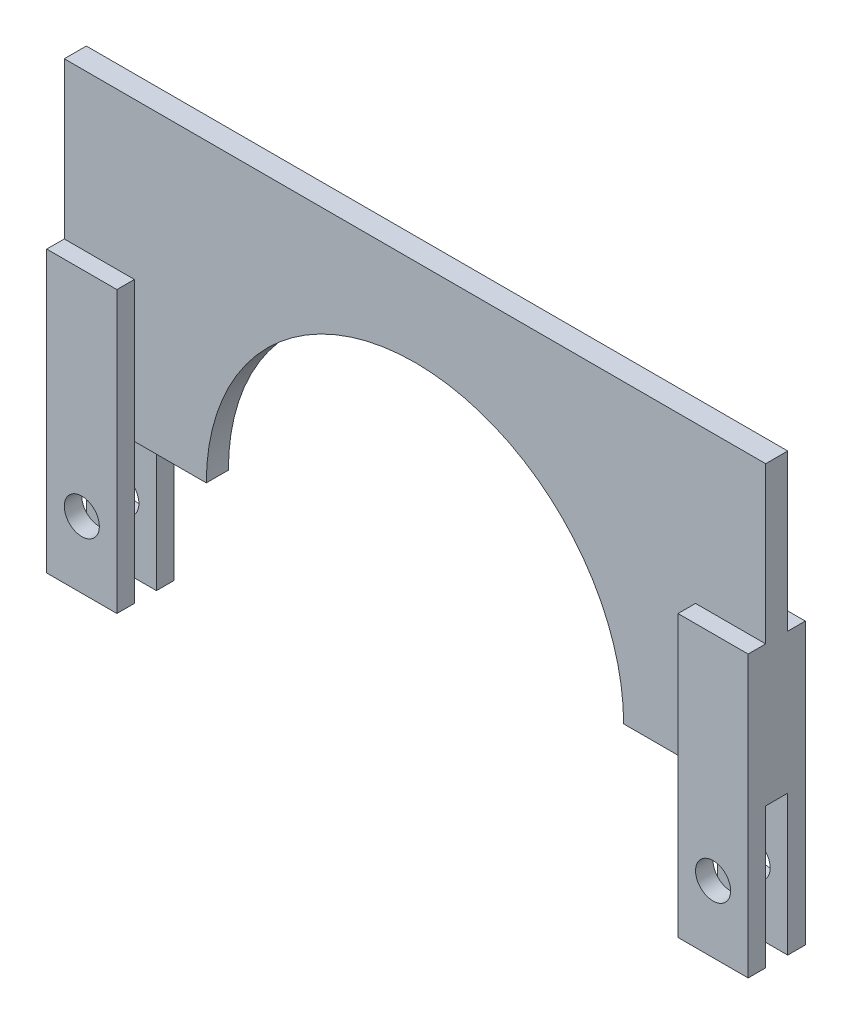
ISO-10303-21;
HEADER;
FILE_DESCRIPTION(('STEP AP214'),'2;1');
FILE_NAME('part.step','',(''),(''),'','','');
FILE_SCHEMA(('AUTOMOTIVE_DESIGN { 1 0 10303 214 1 1 1 1 }'));
ENDSEC;
DATA;
#1=APPLICATION_CONTEXT('core data for automotive mechanical design processes');
#2=APPLICATION_PROTOCOL_DEFINITION('international standard','automotive_design',2000,#1);
#3=PRODUCT_CONTEXT('',#1,'mechanical');
#4=PRODUCT('Part','Part','',(#3));
#5=PRODUCT_RELATED_PRODUCT_CATEGORY('part','',(#4));
#6=PRODUCT_DEFINITION_FORMATION('','',#4);
#7=PRODUCT_DEFINITION_CONTEXT('part definition',#1,'design');
#8=PRODUCT_DEFINITION('design','',#6,#7);
#9=PRODUCT_DEFINITION_SHAPE('','',#8);
#10=(LENGTH_UNIT() NAMED_UNIT(*) SI_UNIT(.MILLI.,.METRE.));
#11=(NAMED_UNIT(*) PLANE_ANGLE_UNIT() SI_UNIT($,.RADIAN.));
#12=(NAMED_UNIT(*) SI_UNIT($,.STERADIAN.) SOLID_ANGLE_UNIT());
#13=UNCERTAINTY_MEASURE_WITH_UNIT(LENGTH_MEASURE(1.E-05),#10,'distance_accuracy_value','');
#14=(GEOMETRIC_REPRESENTATION_CONTEXT(3) GLOBAL_UNCERTAINTY_ASSIGNED_CONTEXT((#13)) GLOBAL_UNIT_ASSIGNED_CONTEXT((#10,
#11,#12)) REPRESENTATION_CONTEXT('',''));
#15=CARTESIAN_POINT('',(0.,0.,0.));
#16=DIRECTION('',(0.,0.,1.));
#17=DIRECTION('',(1.,0.,0.));
#18=AXIS2_PLACEMENT_3D('',#15,#16,#17);
#19=CARTESIAN_POINT('',(0.,0.,0.798558565));
#20=DIRECTION('',(0.,0.,1.));
#21=DIRECTION('',(1.,0.,0.));
#22=AXIS2_PLACEMENT_3D('',#19,#20,#21);
#23=PLANE('',#22);
#24=DIRECTION('',(0.,-1.,0.));
#25=VECTOR('',#24,1.);
#26=CARTESIAN_POINT('',(-25.4,0.,0.798558565));
#27=LINE('',#26,#25);
#28=CARTESIAN_POINT('',(-25.4,21.463,0.798558565));
#29=VERTEX_POINT('',#28);
#30=CARTESIAN_POINT('',(-25.4,10.16,0.798558565));
#31=VERTEX_POINT('',#30);
#32=EDGE_CURVE('E61',#29,#31,#27,.T.);
#33=ORIENTED_EDGE('',*,*,#32,.T.);
#34=DIRECTION('',(-1.,0.,0.));
#35=VECTOR('',#34,1.);
#36=CARTESIAN_POINT('',(0.,10.16,0.798558565));
#37=LINE('',#36,#35);
#38=CARTESIAN_POINT('',(-20.32,10.16,0.798558565));
#39=VERTEX_POINT('',#38);
#40=EDGE_CURVE('E56',#39,#31,#37,.T.);
#41=ORIENTED_EDGE('',*,*,#40,.F.);
#42=DIRECTION('',(0.,1.,0.));
#43=VECTOR('',#42,1.);
#44=CARTESIAN_POINT('',(-20.32,0.,0.798558565));
#45=LINE('',#44,#43);
#46=CARTESIAN_POINT('',(-20.32,0.,0.798558565));
#47=VERTEX_POINT('',#46);
#48=EDGE_CURVE('E238',#47,#39,#45,.T.);
#49=ORIENTED_EDGE('',*,*,#48,.F.);
#50=DIRECTION('',(1.,0.,0.));
#51=VECTOR('',#50,1.);
#52=CARTESIAN_POINT('',(-25.4,0.,0.798558565));
#53=LINE('',#52,#51);
#54=CARTESIAN_POINT('',(-15.113,0.,0.798558565));
#55=VERTEX_POINT('',#54);
#56=EDGE_CURVE('E351',#47,#55,#53,.T.);
#57=ORIENTED_EDGE('',*,*,#56,.T.);
#58=CARTESIAN_POINT('',(0.,0.,0.798558565));
#59=DIRECTION('',(0.,0.,-1.));
#60=DIRECTION('',(1.,0.,0.));
#61=AXIS2_PLACEMENT_3D('',#58,#59,#60);
#62=CIRCLE('',#61,15.113);
#63=CARTESIAN_POINT('',(15.113,0.,0.798558565));
#64=VERTEX_POINT('',#63);
#65=EDGE_CURVE('E338',#55,#64,#62,.T.);
#66=ORIENTED_EDGE('',*,*,#65,.T.);
#67=DIRECTION('',(1.,0.,0.));
#68=VECTOR('',#67,1.);
#69=CARTESIAN_POINT('',(15.113,0.,0.798558565));
#70=LINE('',#69,#68);
#71=CARTESIAN_POINT('',(20.32,0.,0.798558565));
#72=VERTEX_POINT('',#71);
#73=EDGE_CURVE('E343',#64,#72,#70,.T.);
#74=ORIENTED_EDGE('',*,*,#73,.T.);
#75=DIRECTION('',(0.,1.,0.));
#76=VECTOR('',#75,1.);
#77=CARTESIAN_POINT('',(20.32,0.,0.798558565));
#78=LINE('',#77,#76);
#79=CARTESIAN_POINT('',(20.32,10.16,0.798558565));
#80=VERTEX_POINT('',#79);
#81=EDGE_CURVE('E47',#72,#80,#78,.T.);
#82=ORIENTED_EDGE('',*,*,#81,.T.);
#83=DIRECTION('',(1.,0.,0.));
#84=VECTOR('',#83,1.);
#85=CARTESIAN_POINT('',(0.,10.16,0.798558565));
#86=LINE('',#85,#84);
#87=CARTESIAN_POINT('',(25.4,10.16,0.798558565));
#88=VERTEX_POINT('',#87);
#89=EDGE_CURVE('E305',#80,#88,#86,.T.);
#90=ORIENTED_EDGE('',*,*,#89,.T.);
#91=DIRECTION('',(0.,1.,0.));
#92=VECTOR('',#91,1.);
#93=CARTESIAN_POINT('',(25.4,21.463,0.798558565));
#94=LINE('',#93,#92);
#95=CARTESIAN_POINT('',(25.4,21.463,0.798558565));
#96=VERTEX_POINT('',#95);
#97=EDGE_CURVE('E346',#88,#96,#94,.T.);
#98=ORIENTED_EDGE('',*,*,#97,.T.);
#99=DIRECTION('',(-1.,0.,0.));
#100=VECTOR('',#99,1.);
#101=CARTESIAN_POINT('',(-25.4,21.463,0.798558565));
#102=LINE('',#101,#100);
#103=EDGE_CURVE('E348',#96,#29,#102,.T.);
#104=ORIENTED_EDGE('',*,*,#103,.T.);
#105=EDGE_LOOP('',(#33,#41,#49,#57,#66,#74,#82,#90,#98,#104));
#106=FACE_BOUND('',#105,.T.);
#107=ADVANCED_FACE('F38',(#106),#23,.T.);
#108=CARTESIAN_POINT('',(0.,0.,-0.798558565));
#109=DIRECTION('',(0.,0.,1.));
#110=DIRECTION('',(1.,0.,0.));
#111=AXIS2_PLACEMENT_3D('',#108,#109,#110);
#112=PLANE('',#111);
#113=DIRECTION('',(0.,1.,0.));
#114=VECTOR('',#113,1.);
#115=CARTESIAN_POINT('',(-20.32,0.,-0.798558565));
#116=LINE('',#115,#114);
#117=CARTESIAN_POINT('',(-20.32,0.,-0.798558565));
#118=VERTEX_POINT('',#117);
#119=CARTESIAN_POINT('',(-20.32,10.16,-0.798558565));
#120=VERTEX_POINT('',#119);
#121=EDGE_CURVE('E261',#118,#120,#116,.T.);
#122=ORIENTED_EDGE('',*,*,#121,.T.);
#123=DIRECTION('',(-1.,0.,0.));
#124=VECTOR('',#123,1.);
#125=CARTESIAN_POINT('',(0.,10.16,-0.798558565));
#126=LINE('',#125,#124);
#127=CARTESIAN_POINT('',(-25.4,10.16,-0.798558565));
#128=VERTEX_POINT('',#127);
#129=EDGE_CURVE('E217',#120,#128,#126,.T.);
#130=ORIENTED_EDGE('',*,*,#129,.T.);
#131=DIRECTION('',(0.,-1.,0.));
#132=VECTOR('',#131,1.);
#133=CARTESIAN_POINT('',(-25.4,0.,-0.798558565));
#134=LINE('',#133,#132);
#135=CARTESIAN_POINT('',(-25.4,21.463,-0.798558565));
#136=VERTEX_POINT('',#135);
#137=EDGE_CURVE('E366',#136,#128,#134,.T.);
#138=ORIENTED_EDGE('',*,*,#137,.F.);
#139=DIRECTION('',(-1.,0.,0.));
#140=VECTOR('',#139,1.);
#141=CARTESIAN_POINT('',(-25.4,21.463,-0.798558565));
#142=LINE('',#141,#140);
#143=CARTESIAN_POINT('',(25.4,21.463,-0.798558565));
#144=VERTEX_POINT('',#143);
#145=EDGE_CURVE('E364',#144,#136,#142,.T.);
#146=ORIENTED_EDGE('',*,*,#145,.F.);
#147=DIRECTION('',(0.,1.,0.));
#148=VECTOR('',#147,1.);
#149=CARTESIAN_POINT('',(25.4,21.463,-0.798558565));
#150=LINE('',#149,#148);
#151=CARTESIAN_POINT('',(25.4,10.16,-0.798558565));
#152=VERTEX_POINT('',#151);
#153=EDGE_CURVE('E362',#152,#144,#150,.T.);
#154=ORIENTED_EDGE('',*,*,#153,.F.);
#155=DIRECTION('',(1.,0.,0.));
#156=VECTOR('',#155,1.);
#157=CARTESIAN_POINT('',(0.,10.16,-0.798558565));
#158=LINE('',#157,#156);
#159=CARTESIAN_POINT('',(20.32,10.16,-0.798558565));
#160=VERTEX_POINT('',#159);
#161=EDGE_CURVE('E276',#160,#152,#158,.T.);
#162=ORIENTED_EDGE('',*,*,#161,.F.);
#163=DIRECTION('',(0.,1.,0.));
#164=VECTOR('',#163,1.);
#165=CARTESIAN_POINT('',(20.32,0.,-0.798558565));
#166=LINE('',#165,#164);
#167=CARTESIAN_POINT('',(20.32,0.,-0.798558565));
#168=VERTEX_POINT('',#167);
#169=EDGE_CURVE('E11',#168,#160,#166,.T.);
#170=ORIENTED_EDGE('',*,*,#169,.F.);
#171=DIRECTION('',(1.,0.,0.));
#172=VECTOR('',#171,1.);
#173=CARTESIAN_POINT('',(15.113,0.,-0.798558565));
#174=LINE('',#173,#172);
#175=CARTESIAN_POINT('',(15.113,0.,-0.798558565));
#176=VERTEX_POINT('',#175);
#177=EDGE_CURVE('E359',#176,#168,#174,.T.);
#178=ORIENTED_EDGE('',*,*,#177,.F.);
#179=CARTESIAN_POINT('',(0.,0.,-0.798558565));
#180=DIRECTION('',(0.,0.,-1.));
#181=DIRECTION('',(1.,0.,0.));
#182=AXIS2_PLACEMENT_3D('',#179,#180,#181);
#183=CIRCLE('',#182,15.113);
#184=CARTESIAN_POINT('',(-15.113,0.,-0.798558565));
#185=VERTEX_POINT('',#184);
#186=EDGE_CURVE('E337',#185,#176,#183,.T.);
#187=ORIENTED_EDGE('',*,*,#186,.F.);
#188=DIRECTION('',(1.,0.,0.));
#189=VECTOR('',#188,1.);
#190=CARTESIAN_POINT('',(-25.4,0.,-0.798558565));
#191=LINE('',#190,#189);
#192=EDGE_CURVE('E368',#118,#185,#191,.T.);
#193=ORIENTED_EDGE('',*,*,#192,.F.);
#194=EDGE_LOOP('',(#122,#130,#138,#146,#154,#162,#170,#178,#187,#193));
#195=FACE_BOUND('',#194,.T.);
#196=ADVANCED_FACE('F426',(#195),#112,.F.);
#197=CARTESIAN_POINT('',(0.,0.,0.798558565));
#198=DIRECTION('',(0.,0.,-1.));
#199=DIRECTION('',(-1.,0.,0.));
#200=AXIS2_PLACEMENT_3D('',#197,#198,#199);
#201=CYLINDRICAL_SURFACE('',#200,15.113);
#202=ORIENTED_EDGE('',*,*,#186,.T.);
#203=DIRECTION('',(0.,0.,-1.));
#204=VECTOR('',#203,1.);
#205=CARTESIAN_POINT('',(15.113,0.,0.798558565));
#206=LINE('',#205,#204);
#207=EDGE_CURVE('E384',#64,#176,#206,.T.);
#208=ORIENTED_EDGE('',*,*,#207,.F.);
#209=ORIENTED_EDGE('',*,*,#65,.F.);
#210=DIRECTION('',(0.,0.,-1.));
#211=VECTOR('',#210,1.);
#212=CARTESIAN_POINT('',(-15.113,0.,0.798558565));
#213=LINE('',#212,#211);
#214=EDGE_CURVE('E355',#55,#185,#213,.T.);
#215=ORIENTED_EDGE('',*,*,#214,.T.);
#216=EDGE_LOOP('',(#202,#208,#209,#215));
#217=FACE_BOUND('',#216,.T.);
#218=ADVANCED_FACE('F40',(#217),#201,.F.);
#219=CARTESIAN_POINT('',(15.113,0.,0.798558565));
#220=DIRECTION('',(0.,1.,0.));
#221=DIRECTION('',(0.,0.,1.));
#222=AXIS2_PLACEMENT_3D('',#219,#220,#221);
#223=PLANE('',#222);
#224=ORIENTED_EDGE('',*,*,#177,.T.);
#225=CARTESIAN_POINT('',(25.4,0.,-0.798558565));
#226=VERTEX_POINT('',#225);
#227=EDGE_CURVE('E358',#168,#226,#174,.T.);
#228=ORIENTED_EDGE('',*,*,#227,.T.);
#229=DIRECTION('',(0.,0.,-1.));
#230=VECTOR('',#229,1.);
#231=CARTESIAN_POINT('',(25.4,0.,0.798558565));
#232=LINE('',#231,#230);
#233=CARTESIAN_POINT('',(25.4,0.,0.798558565));
#234=VERTEX_POINT('',#233);
#235=EDGE_CURVE('E382',#234,#226,#232,.T.);
#236=ORIENTED_EDGE('',*,*,#235,.F.);
#237=EDGE_CURVE('E341',#72,#234,#70,.T.);
#238=ORIENTED_EDGE('',*,*,#237,.F.);
#239=ORIENTED_EDGE('',*,*,#73,.F.);
#240=ORIENTED_EDGE('',*,*,#207,.T.);
#241=EDGE_LOOP('',(#224,#228,#236,#238,#239,#240));
#242=FACE_BOUND('',#241,.T.);
#243=ADVANCED_FACE('F399',(#242),#223,.F.);
#244=CARTESIAN_POINT('',(25.4,21.463,0.798558565));
#245=DIRECTION('',(-1.,0.,0.));
#246=DIRECTION('',(0.,0.,1.));
#247=AXIS2_PLACEMENT_3D('',#244,#245,#246);
#248=PLANE('',#247);
#249=ORIENTED_EDGE('',*,*,#235,.T.);
#250=DIRECTION('',(0.,1.,0.));
#251=VECTOR('',#250,1.);
#252=CARTESIAN_POINT('',(25.4,0.,-0.798558565));
#253=LINE('',#252,#251);
#254=CARTESIAN_POINT('',(25.4,-10.16,-0.798558565));
#255=VERTEX_POINT('',#254);
#256=EDGE_CURVE('E289',#255,#226,#253,.T.);
#257=ORIENTED_EDGE('',*,*,#256,.F.);
#258=DIRECTION('',(0.,0.,1.));
#259=VECTOR('',#258,1.);
#260=CARTESIAN_POINT('',(25.4,-10.16,-2.068558565));
#261=LINE('',#260,#259);
#262=CARTESIAN_POINT('',(25.4,-10.16,-2.068558565));
#263=VERTEX_POINT('',#262);
#264=EDGE_CURVE('E300',#263,#255,#261,.T.);
#265=ORIENTED_EDGE('',*,*,#264,.F.);
#266=DIRECTION('',(0.,1.,0.));
#267=VECTOR('',#266,1.);
#268=CARTESIAN_POINT('',(25.4,0.,-2.068558565));
#269=LINE('',#268,#267);
#270=CARTESIAN_POINT('',(25.4,10.16,-2.068558565));
#271=VERTEX_POINT('',#270);
#272=EDGE_CURVE('E279',#263,#271,#269,.T.);
#273=ORIENTED_EDGE('',*,*,#272,.T.);
#274=DIRECTION('',(0.,0.,1.));
#275=VECTOR('',#274,1.);
#276=CARTESIAN_POINT('',(25.4,10.16,-2.068558565));
#277=LINE('',#276,#275);
#278=EDGE_CURVE('E302',#271,#152,#277,.T.);
#279=ORIENTED_EDGE('',*,*,#278,.T.);
#280=ORIENTED_EDGE('',*,*,#153,.T.);
#281=DIRECTION('',(0.,0.,-1.));
#282=VECTOR('',#281,1.);
#283=CARTESIAN_POINT('',(25.4,21.463,0.798558565));
#284=LINE('',#283,#282);
#285=EDGE_CURVE('E379',#96,#144,#284,.T.);
#286=ORIENTED_EDGE('',*,*,#285,.F.);
#287=ORIENTED_EDGE('',*,*,#97,.F.);
#288=DIRECTION('',(0.,0.,-1.));
#289=VECTOR('',#288,1.);
#290=CARTESIAN_POINT('',(25.4,10.16,2.068558565));
#291=LINE('',#290,#289);
#292=CARTESIAN_POINT('',(25.4,10.16,2.068558565));
#293=VERTEX_POINT('',#292);
#294=EDGE_CURVE('E318',#293,#88,#291,.T.);
#295=ORIENTED_EDGE('',*,*,#294,.F.);
#296=DIRECTION('',(0.,1.,0.));
#297=VECTOR('',#296,1.);
#298=CARTESIAN_POINT('',(25.4,0.,2.068558565));
#299=LINE('',#298,#297);
#300=CARTESIAN_POINT('',(25.4,-10.16,2.068558565));
#301=VERTEX_POINT('',#300);
#302=EDGE_CURVE('E316',#301,#293,#299,.T.);
#303=ORIENTED_EDGE('',*,*,#302,.F.);
#304=DIRECTION('',(0.,0.,-1.));
#305=VECTOR('',#304,1.);
#306=CARTESIAN_POINT('',(25.4,-10.16,2.068558565));
#307=LINE('',#306,#305);
#308=CARTESIAN_POINT('',(25.4,-10.16,0.798558565));
#309=VERTEX_POINT('',#308);
#310=EDGE_CURVE('E330',#301,#309,#307,.T.);
#311=ORIENTED_EDGE('',*,*,#310,.T.);
#312=DIRECTION('',(0.,1.,0.));
#313=VECTOR('',#312,1.);
#314=CARTESIAN_POINT('',(25.4,0.,0.798558565));
#315=LINE('',#314,#313);
#316=EDGE_CURVE('E310',#309,#234,#315,.T.);
#317=ORIENTED_EDGE('',*,*,#316,.T.);
#318=EDGE_LOOP('',(#249,#257,#265,#273,#279,#280,#286,#287,#295,#303,#311,#317));
#319=FACE_BOUND('',#318,.T.);
#320=ADVANCED_FACE('F403',(#319),#248,.F.);
#321=CARTESIAN_POINT('',(-25.4,21.463,0.798558565));
#322=DIRECTION('',(0.,-1.,0.));
#323=DIRECTION('',(0.,0.,-1.));
#324=AXIS2_PLACEMENT_3D('',#321,#322,#323);
#325=PLANE('',#324);
#326=ORIENTED_EDGE('',*,*,#145,.T.);
#327=DIRECTION('',(0.,0.,-1.));
#328=VECTOR('',#327,1.);
#329=CARTESIAN_POINT('',(-25.4,21.463,0.798558565));
#330=LINE('',#329,#328);
#331=EDGE_CURVE('E376',#29,#136,#330,.T.);
#332=ORIENTED_EDGE('',*,*,#331,.F.);
#333=ORIENTED_EDGE('',*,*,#103,.F.);
#334=ORIENTED_EDGE('',*,*,#285,.T.);
#335=EDGE_LOOP('',(#326,#332,#333,#334));
#336=FACE_BOUND('',#335,.T.);
#337=ADVANCED_FACE('F431',(#336),#325,.F.);
#338=CARTESIAN_POINT('',(-25.4,0.,0.798558565));
#339=DIRECTION('',(1.,0.,0.));
#340=DIRECTION('',(0.,0.,-1.));
#341=AXIS2_PLACEMENT_3D('',#338,#339,#340);
#342=PLANE('',#341);
#343=ORIENTED_EDGE('',*,*,#137,.T.);
#344=DIRECTION('',(0.,0.,1.));
#345=VECTOR('',#344,1.);
#346=CARTESIAN_POINT('',(-25.4,10.16,-2.068558565));
#347=LINE('',#346,#345);
#348=CARTESIAN_POINT('',(-25.4,10.16,-2.068558565));
#349=VERTEX_POINT('',#348);
#350=EDGE_CURVE('E258',#349,#128,#347,.T.);
#351=ORIENTED_EDGE('',*,*,#350,.F.);
#352=DIRECTION('',(0.,1.,0.));
#353=VECTOR('',#352,1.);
#354=CARTESIAN_POINT('',(-25.4,0.,-2.068558565));
#355=LINE('',#354,#353);
#356=CARTESIAN_POINT('',(-25.4,-10.16,-2.068558565));
#357=VERTEX_POINT('',#356);
#358=EDGE_CURVE('E256',#357,#349,#355,.T.);
#359=ORIENTED_EDGE('',*,*,#358,.F.);
#360=DIRECTION('',(0.,0.,1.));
#361=VECTOR('',#360,1.);
#362=CARTESIAN_POINT('',(-25.4,-10.16,-2.068558565));
#363=LINE('',#362,#361);
#364=CARTESIAN_POINT('',(-25.4,-10.16,-0.798558565));
#365=VERTEX_POINT('',#364);
#366=EDGE_CURVE('E270',#357,#365,#363,.T.);
#367=ORIENTED_EDGE('',*,*,#366,.T.);
#368=DIRECTION('',(0.,1.,0.));
#369=VECTOR('',#368,1.);
#370=CARTESIAN_POINT('',(-25.4,0.,-0.798558565));
#371=LINE('',#370,#369);
#372=CARTESIAN_POINT('',(-25.4,0.,-0.798558565));
#373=VERTEX_POINT('',#372);
#374=EDGE_CURVE('E250',#365,#373,#371,.T.);
#375=ORIENTED_EDGE('',*,*,#374,.T.);
#376=DIRECTION('',(0.,0.,-1.));
#377=VECTOR('',#376,1.);
#378=CARTESIAN_POINT('',(-25.4,0.,0.798558565));
#379=LINE('',#378,#377);
#380=CARTESIAN_POINT('',(-25.4,0.,0.798558565));
#381=VERTEX_POINT('',#380);
#382=EDGE_CURVE('E373',#381,#373,#379,.T.);
#383=ORIENTED_EDGE('',*,*,#382,.F.);
#384=DIRECTION('',(0.,1.,0.));
#385=VECTOR('',#384,1.);
#386=CARTESIAN_POINT('',(-25.4,0.,0.798558565));
#387=LINE('',#386,#385);
#388=CARTESIAN_POINT('',(-25.4,-10.16,0.798558565));
#389=VERTEX_POINT('',#388);
#390=EDGE_CURVE('E232',#389,#381,#387,.T.);
#391=ORIENTED_EDGE('',*,*,#390,.F.);
#392=DIRECTION('',(0.,0.,-1.));
#393=VECTOR('',#392,1.);
#394=CARTESIAN_POINT('',(-25.4,-10.16,2.068558565));
#395=LINE('',#394,#393);
#396=CARTESIAN_POINT('',(-25.4,-10.16,2.068558565));
#397=VERTEX_POINT('',#396);
#398=EDGE_CURVE('E218',#397,#389,#395,.T.);
#399=ORIENTED_EDGE('',*,*,#398,.F.);
#400=DIRECTION('',(0.,1.,0.));
#401=VECTOR('',#400,1.);
#402=CARTESIAN_POINT('',(-25.4,0.,2.068558565));
#403=LINE('',#402,#401);
#404=CARTESIAN_POINT('',(-25.4,10.16,2.068558565));
#405=VERTEX_POINT('',#404);
#406=EDGE_CURVE('E206',#397,#405,#403,.T.);
#407=ORIENTED_EDGE('',*,*,#406,.T.);
#408=DIRECTION('',(0.,0.,-1.));
#409=VECTOR('',#408,1.);
#410=CARTESIAN_POINT('',(-25.4,10.16,2.068558565));
#411=LINE('',#410,#409);
#412=EDGE_CURVE('E214',#405,#31,#411,.T.);
#413=ORIENTED_EDGE('',*,*,#412,.T.);
#414=ORIENTED_EDGE('',*,*,#32,.F.);
#415=ORIENTED_EDGE('',*,*,#331,.T.);
#416=EDGE_LOOP('',(#343,#351,#359,#367,#375,#383,#391,#399,#407,#413,#414,#415));
#417=FACE_BOUND('',#416,.T.);
#418=ADVANCED_FACE('F221',(#417),#342,.F.);
#419=CARTESIAN_POINT('',(-25.4,0.,0.798558565));
#420=DIRECTION('',(0.,1.,0.));
#421=DIRECTION('',(0.,0.,1.));
#422=AXIS2_PLACEMENT_3D('',#419,#420,#421);
#423=PLANE('',#422);
#424=EDGE_CURVE('E342',#373,#118,#191,.T.);
#425=ORIENTED_EDGE('',*,*,#424,.T.);
#426=ORIENTED_EDGE('',*,*,#192,.T.);
#427=ORIENTED_EDGE('',*,*,#214,.F.);
#428=ORIENTED_EDGE('',*,*,#56,.F.);
#429=EDGE_CURVE('E352',#381,#47,#53,.T.);
#430=ORIENTED_EDGE('',*,*,#429,.F.);
#431=ORIENTED_EDGE('',*,*,#382,.T.);
#432=EDGE_LOOP('',(#425,#426,#427,#428,#430,#431));
#433=FACE_BOUND('',#432,.T.);
#434=ADVANCED_FACE('F454',(#433),#423,.F.);
#435=CARTESIAN_POINT('',(0.,0.,0.798558565));
#436=DIRECTION('',(0.,0.,1.));
#437=DIRECTION('',(1.,0.,0.));
#438=AXIS2_PLACEMENT_3D('',#435,#436,#437);
#439=PLANE('',#438);
#440=CARTESIAN_POINT('',(22.86,-5.334,0.798558565));
#441=DIRECTION('',(0.,0.,1.));
#442=DIRECTION('',(1.,0.,0.));
#443=AXIS2_PLACEMENT_3D('',#440,#441,#442);
#444=CIRCLE('',#443,1.27);
#445=CARTESIAN_POINT('',(24.13,-5.334,0.798558565));
#446=VERTEX_POINT('',#445);
#447=EDGE_CURVE('E233',#446,#446,#444,.T.);
#448=ORIENTED_EDGE('',*,*,#447,.T.);
#449=EDGE_LOOP('',(#448));
#450=FACE_BOUND('',#449,.T.);
#451=CARTESIAN_POINT('',(20.32,-10.16,0.798558565));
#452=VERTEX_POINT('',#451);
#453=EDGE_CURVE('E321',#452,#72,#78,.T.);
#454=ORIENTED_EDGE('',*,*,#453,.T.);
#455=ORIENTED_EDGE('',*,*,#237,.T.);
#456=ORIENTED_EDGE('',*,*,#316,.F.);
#457=DIRECTION('',(-1.,0.,0.));
#458=VECTOR('',#457,1.);
#459=CARTESIAN_POINT('',(0.,-10.16,0.798558565));
#460=LINE('',#459,#458);
#461=EDGE_CURVE('E324',#309,#452,#460,.T.);
#462=ORIENTED_EDGE('',*,*,#461,.T.);
#463=EDGE_LOOP('',(#454,#455,#456,#462));
#464=FACE_BOUND('',#463,.T.);
#465=ADVANCED_FACE('F395',(#450,#464),#439,.F.);
#466=CARTESIAN_POINT('',(0.,10.16,2.068558565));
#467=DIRECTION('',(0.,1.,0.));
#468=DIRECTION('',(0.,0.,1.));
#469=AXIS2_PLACEMENT_3D('',#466,#467,#468);
#470=PLANE('',#469);
#471=ORIENTED_EDGE('',*,*,#89,.F.);
#472=DIRECTION('',(0.,0.,-1.));
#473=VECTOR('',#472,1.);
#474=CARTESIAN_POINT('',(20.32,10.16,2.068558565));
#475=LINE('',#474,#473);
#476=CARTESIAN_POINT('',(20.32,10.16,2.068558565));
#477=VERTEX_POINT('',#476);
#478=EDGE_CURVE('E334',#477,#80,#475,.T.);
#479=ORIENTED_EDGE('',*,*,#478,.F.);
#480=DIRECTION('',(1.,0.,0.));
#481=VECTOR('',#480,1.);
#482=CARTESIAN_POINT('',(0.,10.16,2.068558565));
#483=LINE('',#482,#481);
#484=EDGE_CURVE('E306',#477,#293,#483,.T.);
#485=ORIENTED_EDGE('',*,*,#484,.T.);
#486=ORIENTED_EDGE('',*,*,#294,.T.);
#487=EDGE_LOOP('',(#471,#479,#485,#486));
#488=FACE_BOUND('',#487,.T.);
#489=ADVANCED_FACE('F481',(#488),#470,.T.);
#490=CARTESIAN_POINT('',(20.32,0.,2.068558565));
#491=DIRECTION('',(-1.,0.,0.));
#492=DIRECTION('',(0.,-1.,0.));
#493=AXIS2_PLACEMENT_3D('',#490,#491,#492);
#494=PLANE('',#493);
#495=ORIENTED_EDGE('',*,*,#453,.F.);
#496=DIRECTION('',(0.,0.,-1.));
#497=VECTOR('',#496,1.);
#498=CARTESIAN_POINT('',(20.32,-10.16,2.068558565));
#499=LINE('',#498,#497);
#500=CARTESIAN_POINT('',(20.32,-10.16,2.068558565));
#501=VERTEX_POINT('',#500);
#502=EDGE_CURVE('E332',#501,#452,#499,.T.);
#503=ORIENTED_EDGE('',*,*,#502,.F.);
#504=DIRECTION('',(0.,1.,0.));
#505=VECTOR('',#504,1.);
#506=CARTESIAN_POINT('',(20.32,0.,2.068558565));
#507=LINE('',#506,#505);
#508=EDGE_CURVE('E309',#501,#477,#507,.T.);
#509=ORIENTED_EDGE('',*,*,#508,.T.);
#510=ORIENTED_EDGE('',*,*,#478,.T.);
#511=ORIENTED_EDGE('',*,*,#81,.F.);
#512=EDGE_LOOP('',(#495,#503,#509,#510,#511));
#513=FACE_BOUND('',#512,.T.);
#514=ADVANCED_FACE('F392',(#513),#494,.T.);
#515=CARTESIAN_POINT('',(0.,-10.16,2.068558565));
#516=DIRECTION('',(0.,-1.,0.));
#517=DIRECTION('',(0.,0.,-1.));
#518=AXIS2_PLACEMENT_3D('',#515,#516,#517);
#519=PLANE('',#518);
#520=ORIENTED_EDGE('',*,*,#461,.F.);
#521=ORIENTED_EDGE('',*,*,#310,.F.);
#522=DIRECTION('',(-1.,0.,0.));
#523=VECTOR('',#522,1.);
#524=CARTESIAN_POINT('',(0.,-10.16,2.068558565));
#525=LINE('',#524,#523);
#526=EDGE_CURVE('E313',#301,#501,#525,.T.);
#527=ORIENTED_EDGE('',*,*,#526,.T.);
#528=ORIENTED_EDGE('',*,*,#502,.T.);
#529=EDGE_LOOP('',(#520,#521,#527,#528));
#530=FACE_BOUND('',#529,.T.);
#531=ADVANCED_FACE('F531',(#530),#519,.T.);
#532=CARTESIAN_POINT('',(0.,0.,2.068558565));
#533=DIRECTION('',(0.,0.,1.));
#534=DIRECTION('',(1.,0.,0.));
#535=AXIS2_PLACEMENT_3D('',#532,#533,#534);
#536=PLANE('',#535);
#537=CARTESIAN_POINT('',(22.86,-5.334,2.068558565));
#538=DIRECTION('',(0.,0.,-1.));
#539=DIRECTION('',(-1.,0.,0.));
#540=AXIS2_PLACEMENT_3D('',#537,#538,#539);
#541=CIRCLE('',#540,1.27);
#542=CARTESIAN_POINT('',(21.59,-5.334,2.068558565));
#543=VERTEX_POINT('',#542);
#544=EDGE_CURVE('E826',#543,#543,#541,.T.);
#545=ORIENTED_EDGE('',*,*,#544,.T.);
#546=EDGE_LOOP('',(#545));
#547=FACE_BOUND('',#546,.T.);
#548=ORIENTED_EDGE('',*,*,#484,.F.);
#549=ORIENTED_EDGE('',*,*,#508,.F.);
#550=ORIENTED_EDGE('',*,*,#526,.F.);
#551=ORIENTED_EDGE('',*,*,#302,.T.);
#552=EDGE_LOOP('',(#548,#549,#550,#551));
#553=FACE_BOUND('',#552,.T.);
#554=ADVANCED_FACE('F537',(#547,#553),#536,.T.);
#555=CARTESIAN_POINT('',(0.,10.16,-2.068558565));
#556=DIRECTION('',(0.,-1.,0.));
#557=DIRECTION('',(0.,0.,-1.));
#558=AXIS2_PLACEMENT_3D('',#555,#556,#557);
#559=PLANE('',#558);
#560=ORIENTED_EDGE('',*,*,#161,.T.);
#561=ORIENTED_EDGE('',*,*,#278,.F.);
#562=DIRECTION('',(1.,0.,0.));
#563=VECTOR('',#562,1.);
#564=CARTESIAN_POINT('',(0.,10.16,-2.068558565));
#565=LINE('',#564,#563);
#566=CARTESIAN_POINT('',(20.32,10.16,-2.068558565));
#567=VERTEX_POINT('',#566);
#568=EDGE_CURVE('E277',#567,#271,#565,.T.);
#569=ORIENTED_EDGE('',*,*,#568,.F.);
#570=DIRECTION('',(0.,0.,1.));
#571=VECTOR('',#570,1.);
#572=CARTESIAN_POINT('',(20.32,10.16,-2.068558565));
#573=LINE('',#572,#571);
#574=EDGE_CURVE('E286',#567,#160,#573,.T.);
#575=ORIENTED_EDGE('',*,*,#574,.T.);
#576=EDGE_LOOP('',(#560,#561,#569,#575));
#577=FACE_BOUND('',#576,.T.);
#578=ADVANCED_FACE('F423',(#577),#559,.F.);
#579=CARTESIAN_POINT('',(0.,-10.16,-2.068558565));
#580=DIRECTION('',(0.,1.,0.));
#581=DIRECTION('',(0.,0.,1.));
#582=AXIS2_PLACEMENT_3D('',#579,#580,#581);
#583=PLANE('',#582);
#584=DIRECTION('',(-1.,0.,0.));
#585=VECTOR('',#584,1.);
#586=CARTESIAN_POINT('',(0.,-10.16,-0.798558565));
#587=LINE('',#586,#585);
#588=CARTESIAN_POINT('',(20.32,-10.16,-0.798558565));
#589=VERTEX_POINT('',#588);
#590=EDGE_CURVE('E292',#255,#589,#587,.T.);
#591=ORIENTED_EDGE('',*,*,#590,.T.);
#592=DIRECTION('',(0.,0.,1.));
#593=VECTOR('',#592,1.);
#594=CARTESIAN_POINT('',(20.32,-10.16,-2.068558565));
#595=LINE('',#594,#593);
#596=CARTESIAN_POINT('',(20.32,-10.16,-2.068558565));
#597=VERTEX_POINT('',#596);
#598=EDGE_CURVE('E297',#597,#589,#595,.T.);
#599=ORIENTED_EDGE('',*,*,#598,.F.);
#600=DIRECTION('',(-1.,0.,0.));
#601=VECTOR('',#600,1.);
#602=CARTESIAN_POINT('',(0.,-10.16,-2.068558565));
#603=LINE('',#602,#601);
#604=EDGE_CURVE('E282',#263,#597,#603,.T.);
#605=ORIENTED_EDGE('',*,*,#604,.F.);
#606=ORIENTED_EDGE('',*,*,#264,.T.);
#607=EDGE_LOOP('',(#591,#599,#605,#606));
#608=FACE_BOUND('',#607,.T.);
#609=ADVANCED_FACE('F410',(#608),#583,.F.);
#610=CARTESIAN_POINT('',(20.32,0.,-2.068558565));
#611=DIRECTION('',(1.,0.,0.));
#612=DIRECTION('',(0.,1.,0.));
#613=AXIS2_PLACEMENT_3D('',#610,#611,#612);
#614=PLANE('',#613);
#615=EDGE_CURVE('E49',#589,#168,#166,.T.);
#616=ORIENTED_EDGE('',*,*,#615,.T.);
#617=ORIENTED_EDGE('',*,*,#169,.T.);
#618=ORIENTED_EDGE('',*,*,#574,.F.);
#619=DIRECTION('',(0.,1.,0.));
#620=VECTOR('',#619,1.);
#621=CARTESIAN_POINT('',(20.32,0.,-2.068558565));
#622=LINE('',#621,#620);
#623=EDGE_CURVE('E284',#597,#567,#622,.T.);
#624=ORIENTED_EDGE('',*,*,#623,.F.);
#625=ORIENTED_EDGE('',*,*,#598,.T.);
#626=EDGE_LOOP('',(#616,#617,#618,#624,#625));
#627=FACE_BOUND('',#626,.T.);
#628=ADVANCED_FACE('F414',(#627),#614,.F.);
#629=CARTESIAN_POINT('',(0.,0.,-2.068558565));
#630=DIRECTION('',(0.,0.,-1.));
#631=DIRECTION('',(1.,0.,0.));
#632=AXIS2_PLACEMENT_3D('',#629,#630,#631);
#633=PLANE('',#632);
#634=CARTESIAN_POINT('',(22.86,-5.334,-2.068558565));
#635=DIRECTION('',(0.,0.,-1.));
#636=DIRECTION('',(-1.,0.,0.));
#637=AXIS2_PLACEMENT_3D('',#634,#635,#636);
#638=CIRCLE('',#637,1.27);
#639=CARTESIAN_POINT('',(21.59,-5.334,-2.068558565));
#640=VERTEX_POINT('',#639);
#641=EDGE_CURVE('E822',#640,#640,#638,.T.);
#642=ORIENTED_EDGE('',*,*,#641,.F.);
#643=EDGE_LOOP('',(#642));
#644=FACE_BOUND('',#643,.T.);
#645=ORIENTED_EDGE('',*,*,#568,.T.);
#646=ORIENTED_EDGE('',*,*,#272,.F.);
#647=ORIENTED_EDGE('',*,*,#604,.T.);
#648=ORIENTED_EDGE('',*,*,#623,.T.);
#649=EDGE_LOOP('',(#645,#646,#647,#648));
#650=FACE_BOUND('',#649,.T.);
#651=ADVANCED_FACE('F418',(#644,#650),#633,.T.);
#652=CARTESIAN_POINT('',(0.,0.,-0.798558565));
#653=DIRECTION('',(0.,0.,-1.));
#654=DIRECTION('',(1.,0.,0.));
#655=AXIS2_PLACEMENT_3D('',#652,#653,#654);
#656=PLANE('',#655);
#657=CARTESIAN_POINT('',(22.86,-5.334,-0.798558565));
#658=DIRECTION('',(0.,0.,-1.));
#659=DIRECTION('',(-1.,0.,0.));
#660=AXIS2_PLACEMENT_3D('',#657,#658,#659);
#661=CIRCLE('',#660,1.27);
#662=CARTESIAN_POINT('',(21.59,-5.334,-0.798558565));
#663=VERTEX_POINT('',#662);
#664=EDGE_CURVE('E42',#663,#663,#661,.T.);
#665=ORIENTED_EDGE('',*,*,#664,.T.);
#666=EDGE_LOOP('',(#665));
#667=FACE_BOUND('',#666,.T.);
#668=ORIENTED_EDGE('',*,*,#227,.F.);
#669=ORIENTED_EDGE('',*,*,#615,.F.);
#670=ORIENTED_EDGE('',*,*,#590,.F.);
#671=ORIENTED_EDGE('',*,*,#256,.T.);
#672=EDGE_LOOP('',(#668,#669,#670,#671));
#673=FACE_BOUND('',#672,.T.);
#674=ADVANCED_FACE('F406',(#667,#673),#656,.F.);
#675=CARTESIAN_POINT('',(0.,0.,-0.798558565));
#676=DIRECTION('',(0.,0.,-1.));
#677=DIRECTION('',(-1.,0.,0.));
#678=AXIS2_PLACEMENT_3D('',#675,#676,#677);
#679=PLANE('',#678);
#680=CARTESIAN_POINT('',(-22.86,-5.334,-0.798558565));
#681=DIRECTION('',(0.,0.,-1.));
#682=DIRECTION('',(-1.,0.,0.));
#683=AXIS2_PLACEMENT_3D('',#680,#681,#682);
#684=CIRCLE('',#683,1.27);
#685=CARTESIAN_POINT('',(-24.13,-5.334,-0.798558565));
#686=VERTEX_POINT('',#685);
#687=EDGE_CURVE('E821',#686,#686,#684,.F.);
#688=ORIENTED_EDGE('',*,*,#687,.F.);
#689=EDGE_LOOP('',(#688));
#690=FACE_BOUND('',#689,.T.);
#691=CARTESIAN_POINT('',(-20.32,-10.16,-0.798558565));
#692=VERTEX_POINT('',#691);
#693=EDGE_CURVE('E262',#692,#118,#116,.T.);
#694=ORIENTED_EDGE('',*,*,#693,.T.);
#695=ORIENTED_EDGE('',*,*,#424,.F.);
#696=ORIENTED_EDGE('',*,*,#374,.F.);
#697=DIRECTION('',(1.,0.,0.));
#698=VECTOR('',#697,1.);
#699=CARTESIAN_POINT('',(0.,-10.16,-0.798558565));
#700=LINE('',#699,#698);
#701=EDGE_CURVE('E264',#365,#692,#700,.T.);
#702=ORIENTED_EDGE('',*,*,#701,.T.);
#703=EDGE_LOOP('',(#694,#695,#696,#702));
#704=FACE_BOUND('',#703,.T.);
#705=ADVANCED_FACE('F452',(#690,#704),#679,.F.);
#706=CARTESIAN_POINT('',(0.,10.16,-2.068558565));
#707=DIRECTION('',(0.,1.,0.));
#708=DIRECTION('',(0.,0.,1.));
#709=AXIS2_PLACEMENT_3D('',#706,#707,#708);
#710=PLANE('',#709);
#711=ORIENTED_EDGE('',*,*,#129,.F.);
#712=DIRECTION('',(0.,0.,1.));
#713=VECTOR('',#712,1.);
#714=CARTESIAN_POINT('',(-20.32,10.16,-2.068558565));
#715=LINE('',#714,#713);
#716=CARTESIAN_POINT('',(-20.32,10.16,-2.068558565));
#717=VERTEX_POINT('',#716);
#718=EDGE_CURVE('E274',#717,#120,#715,.T.);
#719=ORIENTED_EDGE('',*,*,#718,.F.);
#720=DIRECTION('',(-1.,0.,0.));
#721=VECTOR('',#720,1.);
#722=CARTESIAN_POINT('',(0.,10.16,-2.068558565));
#723=LINE('',#722,#721);
#724=EDGE_CURVE('E246',#717,#349,#723,.T.);
#725=ORIENTED_EDGE('',*,*,#724,.T.);
#726=ORIENTED_EDGE('',*,*,#350,.T.);
#727=EDGE_LOOP('',(#711,#719,#725,#726));
#728=FACE_BOUND('',#727,.T.);
#729=ADVANCED_FACE('F439',(#728),#710,.T.);
#730=CARTESIAN_POINT('',(-20.32,0.,-2.068558565));
#731=DIRECTION('',(1.,0.,0.));
#732=DIRECTION('',(0.,1.,0.));
#733=AXIS2_PLACEMENT_3D('',#730,#731,#732);
#734=PLANE('',#733);
#735=ORIENTED_EDGE('',*,*,#693,.F.);
#736=DIRECTION('',(0.,0.,1.));
#737=VECTOR('',#736,1.);
#738=CARTESIAN_POINT('',(-20.32,-10.16,-2.068558565));
#739=LINE('',#738,#737);
#740=CARTESIAN_POINT('',(-20.32,-10.16,-2.068558565));
#741=VERTEX_POINT('',#740);
#742=EDGE_CURVE('E272',#741,#692,#739,.T.);
#743=ORIENTED_EDGE('',*,*,#742,.F.);
#744=DIRECTION('',(0.,1.,0.));
#745=VECTOR('',#744,1.);
#746=CARTESIAN_POINT('',(-20.32,0.,-2.068558565));
#747=LINE('',#746,#745);
#748=EDGE_CURVE('E249',#741,#717,#747,.T.);
#749=ORIENTED_EDGE('',*,*,#748,.T.);
#750=ORIENTED_EDGE('',*,*,#718,.T.);
#751=ORIENTED_EDGE('',*,*,#121,.F.);
#752=EDGE_LOOP('',(#735,#743,#749,#750,#751));
#753=FACE_BOUND('',#752,.T.);
#754=ADVANCED_FACE('F445',(#753),#734,.T.);
#755=CARTESIAN_POINT('',(0.,-10.16,-2.068558565));
#756=DIRECTION('',(0.,-1.,0.));
#757=DIRECTION('',(0.,0.,-1.));
#758=AXIS2_PLACEMENT_3D('',#755,#756,#757);
#759=PLANE('',#758);
#760=ORIENTED_EDGE('',*,*,#701,.F.);
#761=ORIENTED_EDGE('',*,*,#366,.F.);
#762=DIRECTION('',(1.,0.,0.));
#763=VECTOR('',#762,1.);
#764=CARTESIAN_POINT('',(0.,-10.16,-2.068558565));
#765=LINE('',#764,#763);
#766=EDGE_CURVE('E253',#357,#741,#765,.T.);
#767=ORIENTED_EDGE('',*,*,#766,.T.);
#768=ORIENTED_EDGE('',*,*,#742,.T.);
#769=EDGE_LOOP('',(#760,#761,#767,#768));
#770=FACE_BOUND('',#769,.T.);
#771=ADVANCED_FACE('F449',(#770),#759,.T.);
#772=CARTESIAN_POINT('',(0.,0.,-2.068558565));
#773=DIRECTION('',(0.,0.,-1.));
#774=DIRECTION('',(-1.,0.,0.));
#775=AXIS2_PLACEMENT_3D('',#772,#773,#774);
#776=PLANE('',#775);
#777=CARTESIAN_POINT('',(-22.86,-5.334,-2.068558565));
#778=DIRECTION('',(0.,0.,1.));
#779=DIRECTION('',(1.,0.,0.));
#780=AXIS2_PLACEMENT_3D('',#777,#778,#779);
#781=CIRCLE('',#780,1.27);
#782=CARTESIAN_POINT('',(-21.59,-5.334,-2.068558565));
#783=VERTEX_POINT('',#782);
#784=EDGE_CURVE('E818',#783,#783,#781,.T.);
#785=ORIENTED_EDGE('',*,*,#784,.T.);
#786=EDGE_LOOP('',(#785));
#787=FACE_BOUND('',#786,.T.);
#788=ORIENTED_EDGE('',*,*,#724,.F.);
#789=ORIENTED_EDGE('',*,*,#748,.F.);
#790=ORIENTED_EDGE('',*,*,#766,.F.);
#791=ORIENTED_EDGE('',*,*,#358,.T.);
#792=EDGE_LOOP('',(#788,#789,#790,#791));
#793=FACE_BOUND('',#792,.T.);
#794=ADVANCED_FACE('F442',(#787,#793),#776,.T.);
#795=CARTESIAN_POINT('',(0.,0.,0.798558565));
#796=DIRECTION('',(0.,0.,1.));
#797=DIRECTION('',(-1.,0.,0.));
#798=AXIS2_PLACEMENT_3D('',#795,#796,#797);
#799=PLANE('',#798);
#800=CARTESIAN_POINT('',(-22.86,-5.334,0.798558565));
#801=DIRECTION('',(0.,0.,1.));
#802=DIRECTION('',(1.,0.,0.));
#803=AXIS2_PLACEMENT_3D('',#800,#801,#802);
#804=CIRCLE('',#803,1.27);
#805=CARTESIAN_POINT('',(-21.59,-5.334,0.798558565));
#806=VERTEX_POINT('',#805);
#807=EDGE_CURVE('E823',#806,#806,#804,.F.);
#808=ORIENTED_EDGE('',*,*,#807,.F.);
#809=EDGE_LOOP('',(#808));
#810=FACE_BOUND('',#809,.T.);
#811=ORIENTED_EDGE('',*,*,#390,.T.);
#812=ORIENTED_EDGE('',*,*,#429,.T.);
#813=CARTESIAN_POINT('',(-20.32,-10.16,0.798558565));
#814=VERTEX_POINT('',#813);
#815=EDGE_CURVE('E212',#814,#47,#45,.T.);
#816=ORIENTED_EDGE('',*,*,#815,.F.);
#817=DIRECTION('',(1.,0.,0.));
#818=VECTOR('',#817,1.);
#819=CARTESIAN_POINT('',(0.,-10.16,0.798558565));
#820=LINE('',#819,#818);
#821=EDGE_CURVE('E236',#389,#814,#820,.T.);
#822=ORIENTED_EDGE('',*,*,#821,.F.);
#823=EDGE_LOOP('',(#811,#812,#816,#822));
#824=FACE_BOUND('',#823,.T.);
#825=ADVANCED_FACE('F460',(#810,#824),#799,.F.);
#826=CARTESIAN_POINT('',(0.,10.16,2.068558565));
#827=DIRECTION('',(0.,-1.,0.));
#828=DIRECTION('',(0.,0.,-1.));
#829=AXIS2_PLACEMENT_3D('',#826,#827,#828);
#830=PLANE('',#829);
#831=ORIENTED_EDGE('',*,*,#40,.T.);
#832=ORIENTED_EDGE('',*,*,#412,.F.);
#833=DIRECTION('',(-1.,0.,0.));
#834=VECTOR('',#833,1.);
#835=CARTESIAN_POINT('',(0.,10.16,2.068558565));
#836=LINE('',#835,#834);
#837=CARTESIAN_POINT('',(-20.32,10.16,2.068558565));
#838=VERTEX_POINT('',#837);
#839=EDGE_CURVE('E202',#838,#405,#836,.T.);
#840=ORIENTED_EDGE('',*,*,#839,.F.);
#841=DIRECTION('',(0.,0.,-1.));
#842=VECTOR('',#841,1.);
#843=CARTESIAN_POINT('',(-20.32,10.16,2.068558565));
#844=LINE('',#843,#842);
#845=EDGE_CURVE('E230',#838,#39,#844,.T.);
#846=ORIENTED_EDGE('',*,*,#845,.T.);
#847=EDGE_LOOP('',(#831,#832,#840,#846));
#848=FACE_BOUND('',#847,.T.);
#849=ADVANCED_FACE('F215',(#848),#830,.F.);
#850=CARTESIAN_POINT('',(0.,-10.16,2.068558565));
#851=DIRECTION('',(0.,1.,0.));
#852=DIRECTION('',(0.,0.,1.));
#853=AXIS2_PLACEMENT_3D('',#850,#851,#852);
#854=PLANE('',#853);
#855=ORIENTED_EDGE('',*,*,#821,.T.);
#856=DIRECTION('',(0.,0.,-1.));
#857=VECTOR('',#856,1.);
#858=CARTESIAN_POINT('',(-20.32,-10.16,2.068558565));
#859=LINE('',#858,#857);
#860=CARTESIAN_POINT('',(-20.32,-10.16,2.068558565));
#861=VERTEX_POINT('',#860);
#862=EDGE_CURVE('E242',#861,#814,#859,.T.);
#863=ORIENTED_EDGE('',*,*,#862,.F.);
#864=DIRECTION('',(1.,0.,0.));
#865=VECTOR('',#864,1.);
#866=CARTESIAN_POINT('',(0.,-10.16,2.068558565));
#867=LINE('',#866,#865);
#868=EDGE_CURVE('E224',#397,#861,#867,.T.);
#869=ORIENTED_EDGE('',*,*,#868,.F.);
#870=ORIENTED_EDGE('',*,*,#398,.T.);
#871=EDGE_LOOP('',(#855,#863,#869,#870));
#872=FACE_BOUND('',#871,.T.);
#873=ADVANCED_FACE('F464',(#872),#854,.F.);
#874=CARTESIAN_POINT('',(-20.32,0.,2.068558565));
#875=DIRECTION('',(-1.,0.,0.));
#876=DIRECTION('',(0.,-1.,0.));
#877=AXIS2_PLACEMENT_3D('',#874,#875,#876);
#878=PLANE('',#877);
#879=ORIENTED_EDGE('',*,*,#815,.T.);
#880=ORIENTED_EDGE('',*,*,#48,.T.);
#881=ORIENTED_EDGE('',*,*,#845,.F.);
#882=DIRECTION('',(0.,1.,0.));
#883=VECTOR('',#882,1.);
#884=CARTESIAN_POINT('',(-20.32,0.,2.068558565));
#885=LINE('',#884,#883);
#886=EDGE_CURVE('E208',#861,#838,#885,.T.);
#887=ORIENTED_EDGE('',*,*,#886,.F.);
#888=ORIENTED_EDGE('',*,*,#862,.T.);
#889=EDGE_LOOP('',(#879,#880,#881,#887,#888));
#890=FACE_BOUND('',#889,.T.);
#891=ADVANCED_FACE('F466',(#890),#878,.F.);
#892=CARTESIAN_POINT('',(0.,0.,2.068558565));
#893=DIRECTION('',(0.,0.,1.));
#894=DIRECTION('',(-1.,0.,0.));
#895=AXIS2_PLACEMENT_3D('',#892,#893,#894);
#896=PLANE('',#895);
#897=CARTESIAN_POINT('',(-22.86,-5.334,2.068558565));
#898=DIRECTION('',(0.,0.,1.));
#899=DIRECTION('',(1.,0.,0.));
#900=AXIS2_PLACEMENT_3D('',#897,#898,#899);
#901=CIRCLE('',#900,1.27);
#902=CARTESIAN_POINT('',(-21.59,-5.334,2.068558565));
#903=VERTEX_POINT('',#902);
#904=EDGE_CURVE('E829',#903,#903,#901,.T.);
#905=ORIENTED_EDGE('',*,*,#904,.F.);
#906=EDGE_LOOP('',(#905));
#907=FACE_BOUND('',#906,.T.);
#908=ORIENTED_EDGE('',*,*,#839,.T.);
#909=ORIENTED_EDGE('',*,*,#406,.F.);
#910=ORIENTED_EDGE('',*,*,#868,.T.);
#911=ORIENTED_EDGE('',*,*,#886,.T.);
#912=EDGE_LOOP('',(#908,#909,#910,#911));
#913=FACE_BOUND('',#912,.T.);
#914=ADVANCED_FACE('F204',(#907,#913),#896,.T.);
#915=CARTESIAN_POINT('',(22.86,-5.334,2.068558565));
#916=DIRECTION('',(0.,0.,-1.));
#917=DIRECTION('',(-1.,0.,0.));
#918=AXIS2_PLACEMENT_3D('',#915,#916,#917);
#919=CYLINDRICAL_SURFACE('',#918,1.27);
#920=ORIENTED_EDGE('',*,*,#641,.T.);
#921=EDGE_LOOP('',(#920));
#922=FACE_BOUND('',#921,.T.);
#923=ORIENTED_EDGE('',*,*,#664,.F.);
#924=EDGE_LOOP('',(#923));
#925=FACE_BOUND('',#924,.T.);
#926=ADVANCED_FACE('F639',(#922,#925),#919,.F.);
#927=ORIENTED_EDGE('',*,*,#544,.F.);
#928=EDGE_LOOP('',(#927));
#929=FACE_BOUND('',#928,.T.);
#930=ORIENTED_EDGE('',*,*,#447,.F.);
#931=EDGE_LOOP('',(#930));
#932=FACE_BOUND('',#931,.T.);
#933=ADVANCED_FACE('F647',(#929,#932),#919,.F.);
#934=CARTESIAN_POINT('',(-22.86,-5.334,2.068558565));
#935=DIRECTION('',(0.,0.,-1.));
#936=DIRECTION('',(-1.,0.,0.));
#937=AXIS2_PLACEMENT_3D('',#934,#935,#936);
#938=CYLINDRICAL_SURFACE('',#937,1.27);
#939=ORIENTED_EDGE('',*,*,#904,.T.);
#940=EDGE_LOOP('',(#939));
#941=FACE_BOUND('',#940,.T.);
#942=ORIENTED_EDGE('',*,*,#807,.T.);
#943=EDGE_LOOP('',(#942));
#944=FACE_BOUND('',#943,.T.);
#945=ADVANCED_FACE('F654',(#941,#944),#938,.F.);
#946=ORIENTED_EDGE('',*,*,#784,.F.);
#947=EDGE_LOOP('',(#946));
#948=FACE_BOUND('',#947,.T.);
#949=ORIENTED_EDGE('',*,*,#687,.T.);
#950=EDGE_LOOP('',(#949));
#951=FACE_BOUND('',#950,.T.);
#952=ADVANCED_FACE('F660',(#948,#951),#938,.F.);
#953=CLOSED_SHELL('',(#107,#196,#218,#243,#320,#337,#418,#434,#465,#489,#514,#531,#554,#578,
#609,#628,#651,#674,#705,#729,#754,#771,#794,#825,#849,#873,#891,#914,#926,#933,#945,#952));
#954=MANIFOLD_SOLID_BREP('B2',#953);
#955=ADVANCED_BREP_SHAPE_REPRESENTATION('',(#18,#954),#14);
#956=SHAPE_DEFINITION_REPRESENTATION(#9,#955);
ENDSEC;
END-ISO-10303-21;
